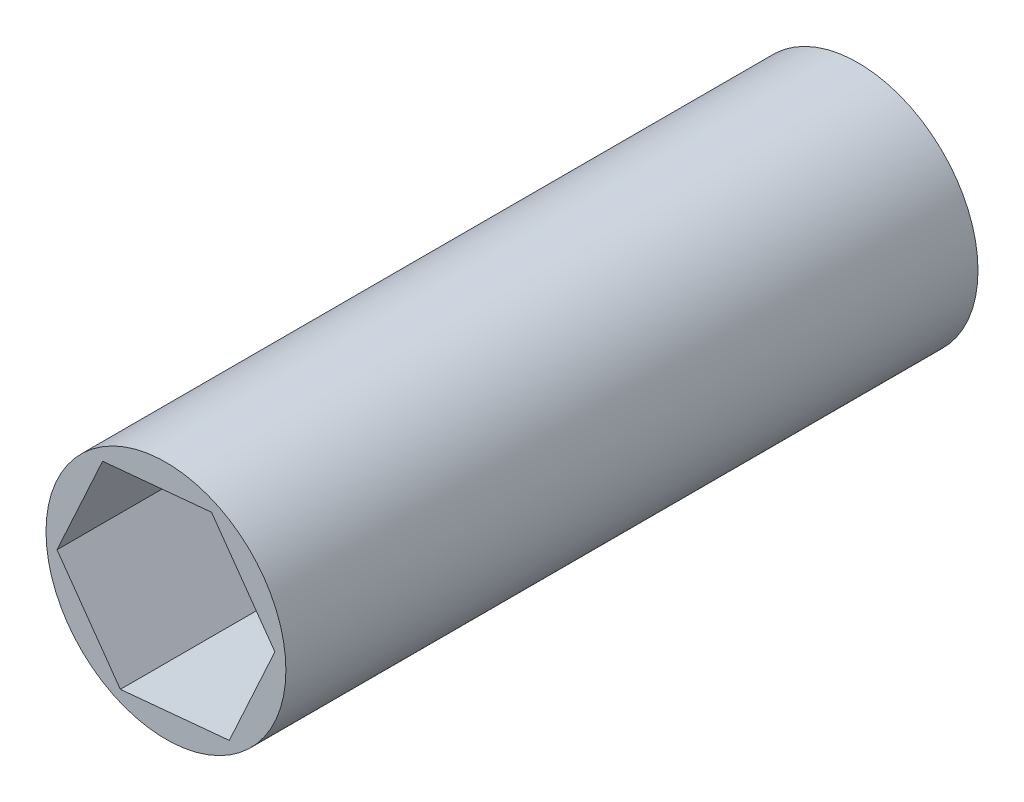
ISO-10303-21;
HEADER;
FILE_DESCRIPTION(('STEP AP214'),'2;1');
FILE_NAME('part.step','',(''),(''),'','','');
FILE_SCHEMA(('AUTOMOTIVE_DESIGN { 1 0 10303 214 1 1 1 1 }'));
ENDSEC;
DATA;
#1=APPLICATION_CONTEXT('core data for automotive mechanical design processes');
#2=APPLICATION_PROTOCOL_DEFINITION('international standard','automotive_design',2000,#1);
#3=PRODUCT_CONTEXT('',#1,'mechanical');
#4=PRODUCT('Part','Part','',(#3));
#5=PRODUCT_RELATED_PRODUCT_CATEGORY('part','',(#4));
#6=PRODUCT_DEFINITION_FORMATION('','',#4);
#7=PRODUCT_DEFINITION_CONTEXT('part definition',#1,'design');
#8=PRODUCT_DEFINITION('design','',#6,#7);
#9=PRODUCT_DEFINITION_SHAPE('','',#8);
#10=(LENGTH_UNIT() NAMED_UNIT(*) SI_UNIT(.MILLI.,.METRE.));
#11=(NAMED_UNIT(*) PLANE_ANGLE_UNIT() SI_UNIT($,.RADIAN.));
#12=(NAMED_UNIT(*) SI_UNIT($,.STERADIAN.) SOLID_ANGLE_UNIT());
#13=UNCERTAINTY_MEASURE_WITH_UNIT(LENGTH_MEASURE(1.E-05),#10,'distance_accuracy_value','');
#14=(GEOMETRIC_REPRESENTATION_CONTEXT(3) GLOBAL_UNCERTAINTY_ASSIGNED_CONTEXT((#13)) GLOBAL_UNIT_ASSIGNED_CONTEXT((#10,
#11,#12)) REPRESENTATION_CONTEXT('',''));
#15=CARTESIAN_POINT('',(0.,0.,0.));
#16=DIRECTION('',(0.,0.,1.));
#17=DIRECTION('',(1.,0.,0.));
#18=AXIS2_PLACEMENT_3D('',#15,#16,#17);
#19=CARTESIAN_POINT('',(0.,0.,36.6395));
#20=DIRECTION('',(0.,0.,1.));
#21=DIRECTION('',(1.,0.,0.));
#22=AXIS2_PLACEMENT_3D('',#19,#20,#21);
#23=PLANE('',#22);
#24=CARTESIAN_POINT('',(0.,0.,36.6395));
#25=DIRECTION('',(0.,0.,1.));
#26=DIRECTION('',(1.,0.,0.));
#27=AXIS2_PLACEMENT_3D('',#24,#25,#26);
#28=CIRCLE('',#27,6.35);
#29=CARTESIAN_POINT('',(6.35,0.,36.6395));
#30=VERTEX_POINT('',#29);
#31=EDGE_CURVE('E11',#30,#30,#28,.T.);
#32=ORIENTED_EDGE('',*,*,#31,.T.);
#33=EDGE_LOOP('',(#32));
#34=FACE_BOUND('',#33,.T.);
#35=DIRECTION('',(-0.416593831263027,-0.90909272340812,0.));
#36=VECTOR('',#35,1.);
#37=CARTESIAN_POINT('',(-3.35389225461433,4.72282786874255,36.6395));
#38=LINE('',#37,#36);
#39=CARTESIAN_POINT('',(-3.35389225461433,4.72282786874255,36.6395));
#40=VERTEX_POINT('',#39);
#41=CARTESIAN_POINT('',(-5.76703503933933,-0.543141959680603,36.6395));
#42=VERTEX_POINT('',#41);
#43=EDGE_CURVE('E96',#40,#42,#38,.T.);
#44=ORIENTED_EDGE('',*,*,#43,.F.);
#45=DIRECTION('',(-0.995594308498526,-0.0937655207703908,0.));
#46=VECTOR('',#45,1.);
#47=CARTESIAN_POINT('',(2.413142784725,5.26596982842316,36.6395));
#48=LINE('',#47,#46);
#49=CARTESIAN_POINT('',(2.413142784725,5.26596982842316,36.6395));
#50=VERTEX_POINT('',#49);
#51=EDGE_CURVE('E88',#50,#40,#48,.T.);
#52=ORIENTED_EDGE('',*,*,#51,.F.);
#53=DIRECTION('',(-0.579000477235498,0.81532720263773,0.));
#54=VECTOR('',#53,1.);
#55=CARTESIAN_POINT('',(5.76703503933933,0.543141959680604,36.6395));
#56=LINE('',#55,#54);
#57=CARTESIAN_POINT('',(5.76703503933933,0.543141959680604,36.6395));
#58=VERTEX_POINT('',#57);
#59=EDGE_CURVE('E116',#58,#50,#56,.T.);
#60=ORIENTED_EDGE('',*,*,#59,.F.);
#61=DIRECTION('',(0.416593831263027,0.90909272340812,0.));
#62=VECTOR('',#61,1.);
#63=CARTESIAN_POINT('',(3.35389225461433,-4.72282786874255,36.6395));
#64=LINE('',#63,#62);
#65=CARTESIAN_POINT('',(3.35389225461433,-4.72282786874255,36.6395));
#66=VERTEX_POINT('',#65);
#67=EDGE_CURVE('E114',#66,#58,#64,.T.);
#68=ORIENTED_EDGE('',*,*,#67,.F.);
#69=DIRECTION('',(0.995594308498526,0.0937655207703912,0.));
#70=VECTOR('',#69,1.);
#71=CARTESIAN_POINT('',(-2.413142784725,-5.26596982842316,36.6395));
#72=LINE('',#71,#70);
#73=CARTESIAN_POINT('',(-2.413142784725,-5.26596982842316,36.6395));
#74=VERTEX_POINT('',#73);
#75=EDGE_CURVE('E110',#74,#66,#72,.T.);
#76=ORIENTED_EDGE('',*,*,#75,.F.);
#77=DIRECTION('',(0.579000477235498,-0.815327202637729,0.));
#78=VECTOR('',#77,1.);
#79=CARTESIAN_POINT('',(-5.76703503933933,-0.543141959680603,36.6395));
#80=LINE('',#79,#78);
#81=EDGE_CURVE('E108',#42,#74,#80,.T.);
#82=ORIENTED_EDGE('',*,*,#81,.F.);
#83=EDGE_LOOP('',(#44,#52,#60,#68,#76,#82));
#84=FACE_BOUND('',#83,.T.);
#85=ADVANCED_FACE('F35',(#34,#84),#23,.T.);
#86=CARTESIAN_POINT('',(0.,0.,0.));
#87=DIRECTION('',(0.,0.,1.));
#88=DIRECTION('',(1.,0.,0.));
#89=AXIS2_PLACEMENT_3D('',#86,#87,#88);
#90=PLANE('',#89);
#91=CARTESIAN_POINT('',(0.,0.,0.));
#92=DIRECTION('',(0.,0.,1.));
#93=DIRECTION('',(1.,0.,0.));
#94=AXIS2_PLACEMENT_3D('',#91,#92,#93);
#95=CIRCLE('',#94,6.35);
#96=CARTESIAN_POINT('',(6.35,0.,0.));
#97=VERTEX_POINT('',#96);
#98=EDGE_CURVE('E39',#97,#97,#95,.T.);
#99=ORIENTED_EDGE('',*,*,#98,.F.);
#100=EDGE_LOOP('',(#99));
#101=FACE_BOUND('',#100,.T.);
#102=DIRECTION('',(-0.995594308498526,-0.0937655207703908,0.));
#103=VECTOR('',#102,1.);
#104=CARTESIAN_POINT('',(2.413142784725,5.26596982842316,0.));
#105=LINE('',#104,#103);
#106=CARTESIAN_POINT('',(2.413142784725,5.26596982842316,0.));
#107=VERTEX_POINT('',#106);
#108=CARTESIAN_POINT('',(-3.35389225461433,4.72282786874255,0.));
#109=VERTEX_POINT('',#108);
#110=EDGE_CURVE('E58',#107,#109,#105,.T.);
#111=ORIENTED_EDGE('',*,*,#110,.T.);
#112=DIRECTION('',(-0.416593831263027,-0.90909272340812,0.));
#113=VECTOR('',#112,1.);
#114=CARTESIAN_POINT('',(-3.35389225461433,4.72282786874255,0.));
#115=LINE('',#114,#113);
#116=CARTESIAN_POINT('',(-5.76703503933933,-0.543141959680603,0.));
#117=VERTEX_POINT('',#116);
#118=EDGE_CURVE('E103',#109,#117,#115,.T.);
#119=ORIENTED_EDGE('',*,*,#118,.T.);
#120=DIRECTION('',(0.579000477235498,-0.815327202637729,0.));
#121=VECTOR('',#120,1.);
#122=CARTESIAN_POINT('',(-5.76703503933933,-0.543141959680603,0.));
#123=LINE('',#122,#121);
#124=CARTESIAN_POINT('',(-2.413142784725,-5.26596982842316,0.));
#125=VERTEX_POINT('',#124);
#126=EDGE_CURVE('E120',#117,#125,#123,.T.);
#127=ORIENTED_EDGE('',*,*,#126,.T.);
#128=DIRECTION('',(0.995594308498526,0.0937655207703912,0.));
#129=VECTOR('',#128,1.);
#130=CARTESIAN_POINT('',(-2.413142784725,-5.26596982842316,0.));
#131=LINE('',#130,#129);
#132=CARTESIAN_POINT('',(3.35389225461433,-4.72282786874255,0.));
#133=VERTEX_POINT('',#132);
#134=EDGE_CURVE('E123',#125,#133,#131,.T.);
#135=ORIENTED_EDGE('',*,*,#134,.T.);
#136=DIRECTION('',(0.416593831263027,0.90909272340812,0.));
#137=VECTOR('',#136,1.);
#138=CARTESIAN_POINT('',(3.35389225461433,-4.72282786874255,0.));
#139=LINE('',#138,#137);
#140=CARTESIAN_POINT('',(5.76703503933933,0.543141959680604,0.));
#141=VERTEX_POINT('',#140);
#142=EDGE_CURVE('E126',#133,#141,#139,.T.);
#143=ORIENTED_EDGE('',*,*,#142,.T.);
#144=DIRECTION('',(-0.579000477235498,0.81532720263773,0.));
#145=VECTOR('',#144,1.);
#146=CARTESIAN_POINT('',(5.76703503933933,0.543141959680604,0.));
#147=LINE('',#146,#145);
#148=EDGE_CURVE('E97',#141,#107,#147,.T.);
#149=ORIENTED_EDGE('',*,*,#148,.T.);
#150=EDGE_LOOP('',(#111,#119,#127,#135,#143,#149));
#151=FACE_BOUND('',#150,.T.);
#152=ADVANCED_FACE('F143',(#101,#151),#90,.F.);
#153=CARTESIAN_POINT('',(0.,0.,36.6395));
#154=DIRECTION('',(0.,0.,-1.));
#155=DIRECTION('',(-1.,0.,0.));
#156=AXIS2_PLACEMENT_3D('',#153,#154,#155);
#157=CYLINDRICAL_SURFACE('',#156,6.35);
#158=ORIENTED_EDGE('',*,*,#31,.F.);
#159=EDGE_LOOP('',(#158));
#160=FACE_BOUND('',#159,.T.);
#161=ORIENTED_EDGE('',*,*,#98,.T.);
#162=EDGE_LOOP('',(#161));
#163=FACE_BOUND('',#162,.T.);
#164=ADVANCED_FACE('F37',(#160,#163),#157,.T.);
#165=CARTESIAN_POINT('',(2.413142784725,5.26596982842316,36.6395));
#166=DIRECTION('',(0.0937655207703908,-0.995594308498526,0.));
#167=DIRECTION('',(0.995594308498526,0.0937655207703908,0.));
#168=AXIS2_PLACEMENT_3D('',#165,#166,#167);
#169=PLANE('',#168);
#170=ORIENTED_EDGE('',*,*,#110,.F.);
#171=DIRECTION('',(0.,0.,-1.));
#172=VECTOR('',#171,1.);
#173=CARTESIAN_POINT('',(2.413142784725,5.26596982842316,36.6395));
#174=LINE('',#173,#172);
#175=EDGE_CURVE('E92',#50,#107,#174,.T.);
#176=ORIENTED_EDGE('',*,*,#175,.F.);
#177=ORIENTED_EDGE('',*,*,#51,.T.);
#178=DIRECTION('',(0.,0.,-1.));
#179=VECTOR('',#178,1.);
#180=CARTESIAN_POINT('',(-3.35389225461433,4.72282786874255,36.6395));
#181=LINE('',#180,#179);
#182=EDGE_CURVE('E91',#40,#109,#181,.T.);
#183=ORIENTED_EDGE('',*,*,#182,.T.);
#184=EDGE_LOOP('',(#170,#176,#177,#183));
#185=FACE_BOUND('',#184,.T.);
#186=ADVANCED_FACE('F90',(#185),#169,.T.);
#187=CARTESIAN_POINT('',(-3.35389225461433,4.72282786874255,36.6395));
#188=DIRECTION('',(0.90909272340812,-0.416593831263027,0.));
#189=DIRECTION('',(0.416593831263027,0.90909272340812,0.));
#190=AXIS2_PLACEMENT_3D('',#187,#188,#189);
#191=PLANE('',#190);
#192=ORIENTED_EDGE('',*,*,#118,.F.);
#193=ORIENTED_EDGE('',*,*,#182,.F.);
#194=ORIENTED_EDGE('',*,*,#43,.T.);
#195=DIRECTION('',(0.,0.,-1.));
#196=VECTOR('',#195,1.);
#197=CARTESIAN_POINT('',(-5.76703503933933,-0.543141959680603,36.6395));
#198=LINE('',#197,#196);
#199=EDGE_CURVE('E104',#42,#117,#198,.T.);
#200=ORIENTED_EDGE('',*,*,#199,.T.);
#201=EDGE_LOOP('',(#192,#193,#194,#200));
#202=FACE_BOUND('',#201,.T.);
#203=ADVANCED_FACE('F100',(#202),#191,.T.);
#204=CARTESIAN_POINT('',(-5.76703503933933,-0.543141959680603,36.6395));
#205=DIRECTION('',(0.815327202637729,0.579000477235498,0.));
#206=DIRECTION('',(-0.579000477235498,0.815327202637729,0.));
#207=AXIS2_PLACEMENT_3D('',#204,#205,#206);
#208=PLANE('',#207);
#209=ORIENTED_EDGE('',*,*,#126,.F.);
#210=ORIENTED_EDGE('',*,*,#199,.F.);
#211=ORIENTED_EDGE('',*,*,#81,.T.);
#212=DIRECTION('',(0.,0.,-1.));
#213=VECTOR('',#212,1.);
#214=CARTESIAN_POINT('',(-2.413142784725,-5.26596982842316,36.6395));
#215=LINE('',#214,#213);
#216=EDGE_CURVE('E135',#74,#125,#215,.T.);
#217=ORIENTED_EDGE('',*,*,#216,.T.);
#218=EDGE_LOOP('',(#209,#210,#211,#217));
#219=FACE_BOUND('',#218,.T.);
#220=ADVANCED_FACE('F139',(#219),#208,.T.);
#221=CARTESIAN_POINT('',(-2.413142784725,-5.26596982842316,36.6395));
#222=DIRECTION('',(-0.0937655207703912,0.995594308498526,0.));
#223=DIRECTION('',(-0.995594308498526,-0.0937655207703912,0.));
#224=AXIS2_PLACEMENT_3D('',#221,#222,#223);
#225=PLANE('',#224);
#226=ORIENTED_EDGE('',*,*,#134,.F.);
#227=ORIENTED_EDGE('',*,*,#216,.F.);
#228=ORIENTED_EDGE('',*,*,#75,.T.);
#229=DIRECTION('',(0.,0.,-1.));
#230=VECTOR('',#229,1.);
#231=CARTESIAN_POINT('',(3.35389225461433,-4.72282786874255,36.6395));
#232=LINE('',#231,#230);
#233=EDGE_CURVE('E133',#66,#133,#232,.T.);
#234=ORIENTED_EDGE('',*,*,#233,.T.);
#235=EDGE_LOOP('',(#226,#227,#228,#234));
#236=FACE_BOUND('',#235,.T.);
#237=ADVANCED_FACE('F151',(#236),#225,.T.);
#238=CARTESIAN_POINT('',(3.35389225461433,-4.72282786874255,36.6395));
#239=DIRECTION('',(-0.90909272340812,0.416593831263027,0.));
#240=DIRECTION('',(-0.416593831263027,-0.90909272340812,0.));
#241=AXIS2_PLACEMENT_3D('',#238,#239,#240);
#242=PLANE('',#241);
#243=ORIENTED_EDGE('',*,*,#142,.F.);
#244=ORIENTED_EDGE('',*,*,#233,.F.);
#245=ORIENTED_EDGE('',*,*,#67,.T.);
#246=DIRECTION('',(0.,0.,-1.));
#247=VECTOR('',#246,1.);
#248=CARTESIAN_POINT('',(5.76703503933933,0.543141959680604,36.6395));
#249=LINE('',#248,#247);
#250=EDGE_CURVE('E50',#58,#141,#249,.T.);
#251=ORIENTED_EDGE('',*,*,#250,.T.);
#252=EDGE_LOOP('',(#243,#244,#245,#251));
#253=FACE_BOUND('',#252,.T.);
#254=ADVANCED_FACE('F149',(#253),#242,.T.);
#255=CARTESIAN_POINT('',(5.76703503933933,0.543141959680604,36.6395));
#256=DIRECTION('',(-0.815327202637729,-0.579000477235498,0.));
#257=DIRECTION('',(0.579000477235498,-0.81532720263773,0.));
#258=AXIS2_PLACEMENT_3D('',#255,#256,#257);
#259=PLANE('',#258);
#260=ORIENTED_EDGE('',*,*,#148,.F.);
#261=ORIENTED_EDGE('',*,*,#250,.F.);
#262=ORIENTED_EDGE('',*,*,#59,.T.);
#263=ORIENTED_EDGE('',*,*,#175,.T.);
#264=EDGE_LOOP('',(#260,#261,#262,#263));
#265=FACE_BOUND('',#264,.T.);
#266=ADVANCED_FACE('F145',(#265),#259,.T.);
#267=CLOSED_SHELL('',(#85,#152,#164,#186,#203,#220,#237,#254,#266));
#268=MANIFOLD_SOLID_BREP('B2',#267);
#269=ADVANCED_BREP_SHAPE_REPRESENTATION('',(#18,#268),#14);
#270=SHAPE_DEFINITION_REPRESENTATION(#9,#269);
ENDSEC;
END-ISO-10303-21;
